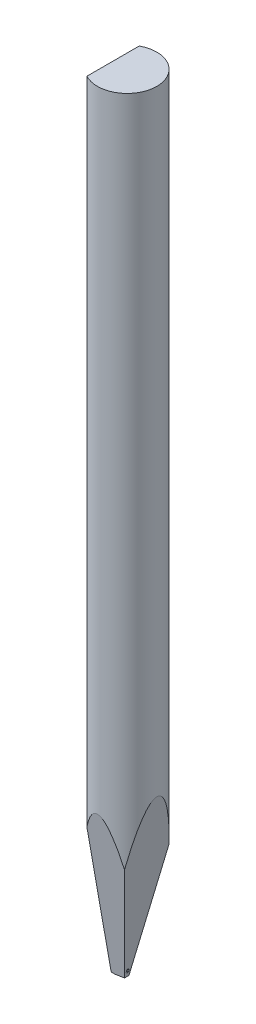
ISO-10303-21;
HEADER;
FILE_DESCRIPTION(('STEP AP214'),'2;1');
FILE_NAME('part.step','',(''),(''),'','','');
FILE_SCHEMA(('AUTOMOTIVE_DESIGN { 1 0 10303 214 1 1 1 1 }'));
ENDSEC;
DATA;
#1=APPLICATION_CONTEXT('core data for automotive mechanical design processes');
#2=APPLICATION_PROTOCOL_DEFINITION('international standard','automotive_design',2000,#1);
#3=PRODUCT_CONTEXT('',#1,'mechanical');
#4=PRODUCT('Part','Part','',(#3));
#5=PRODUCT_RELATED_PRODUCT_CATEGORY('part','',(#4));
#6=PRODUCT_DEFINITION_FORMATION('','',#4);
#7=PRODUCT_DEFINITION_CONTEXT('part definition',#1,'design');
#8=PRODUCT_DEFINITION('design','',#6,#7);
#9=PRODUCT_DEFINITION_SHAPE('','',#8);
#10=(LENGTH_UNIT() NAMED_UNIT(*) SI_UNIT(.MILLI.,.METRE.));
#11=(NAMED_UNIT(*) PLANE_ANGLE_UNIT() SI_UNIT($,.RADIAN.));
#12=(NAMED_UNIT(*) SI_UNIT($,.STERADIAN.) SOLID_ANGLE_UNIT());
#13=UNCERTAINTY_MEASURE_WITH_UNIT(LENGTH_MEASURE(1.E-05),#10,'distance_accuracy_value','');
#14=(GEOMETRIC_REPRESENTATION_CONTEXT(3) GLOBAL_UNCERTAINTY_ASSIGNED_CONTEXT((#13)) GLOBAL_UNIT_ASSIGNED_CONTEXT((#10,
#11,#12)) REPRESENTATION_CONTEXT('',''));
#15=CARTESIAN_POINT('',(0.,0.,0.));
#16=DIRECTION('',(0.,0.,1.));
#17=DIRECTION('',(1.,0.,0.));
#18=AXIS2_PLACEMENT_3D('',#15,#16,#17);
#19=CARTESIAN_POINT('',(26.8738719491216,0.,0.0508));
#20=DIRECTION('',(0.,-0.173648177666931,0.984807753012208));
#21=DIRECTION('',(0.,-0.984807753012208,-0.173648177666931));
#22=AXIS2_PLACEMENT_3D('',#19,#20,#21);
#23=PLANE('',#22);
#24=CARTESIAN_POINT('',(-0.35306,0.02286,0.0548308347789982));
#25=DIRECTION('',(0.,-0.173648177666931,0.984807753012208));
#26=DIRECTION('',(0.,-0.984807753012208,-0.173648177666931));
#27=AXIS2_PLACEMENT_3D('',#24,#25,#26);
#28=ELLIPSE('',#27,0.0232126523477081,0.02286);
#29=CARTESIAN_POINT('',(-0.35306,0.,0.0508000000000026));
#30=VERTEX_POINT('',#29);
#31=CARTESIAN_POINT('',(-0.37592,0.02286,0.0548308347789982));
#32=VERTEX_POINT('',#31);
#33=EDGE_CURVE('E216',#30,#32,#28,.F.);
#34=ORIENTED_EDGE('',*,*,#33,.F.);
#35=DIRECTION('',(-1.,0.,0.));
#36=VECTOR('',#35,1.);
#37=CARTESIAN_POINT('',(26.8738719491216,0.,0.0508));
#38=LINE('',#37,#36);
#39=CARTESIAN_POINT('',(-0.287019999999997,0.,0.0508));
#40=VERTEX_POINT('',#39);
#41=EDGE_CURVE('E287',#40,#30,#38,.T.);
#42=ORIENTED_EDGE('',*,*,#41,.F.);
#43=DIRECTION('',(-0.984346441568213,-0.173566836012845,-0.0306045161452665));
#44=VECTOR('',#43,1.);
#45=CARTESIAN_POINT('',(26.0301980698046,4.64043560289492,0.869033999030531));
#46=LINE('',#45,#44);
#47=CARTESIAN_POINT('',(-0.0117618940403387,0.0485354307393987,0.0593581059596632));
#48=VERTEX_POINT('',#47);
#49=EDGE_CURVE('E284',#48,#40,#46,.T.);
#50=ORIENTED_EDGE('',*,*,#49,.F.);
#51=DIRECTION('',(-0.171087869746036,-0.970287525247814,-0.171087869746036));
#52=VECTOR('',#51,1.);
#53=CARTESIAN_POINT('',(0.766901483986011,4.46455489014234,0.838021483986016));
#54=LINE('',#53,#52);
#55=CARTESIAN_POINT('',(0.523678555180163,3.08516911589156,0.594798555180167));
#56=VERTEX_POINT('',#55);
#57=EDGE_CURVE('E281',#56,#48,#54,.T.);
#58=ORIENTED_EDGE('',*,*,#57,.F.);
#59=CARTESIAN_POINT('',(0.,-0.288101116436578,0.));
#60=DIRECTION('',(0.,-0.173648177666931,0.984807753012208));
#61=DIRECTION('',(0.,-0.984807753012208,-0.173648177666931));
#62=AXIS2_PLACEMENT_3D('',#59,#60,#61);
#63=ELLIPSE('',#62,4.56371043248163,0.792479999999998);
#64=CARTESIAN_POINT('',(-0.37592,3.66844093071415,0.69764511322018));
#65=VERTEX_POINT('',#64);
#66=EDGE_CURVE('E292',#56,#65,#63,.T.);
#67=ORIENTED_EDGE('',*,*,#66,.T.);
#68=DIRECTION('',(0.,0.984807753012208,0.173648177666931));
#69=VECTOR('',#68,1.);
#70=CARTESIAN_POINT('',(-0.37592,20.251112252608,3.62161747949059));
#71=LINE('',#70,#69);
#72=EDGE_CURVE('E306',#32,#65,#71,.T.);
#73=ORIENTED_EDGE('',*,*,#72,.F.);
#74=EDGE_LOOP('',(#34,#42,#50,#58,#67,#73));
#75=FACE_BOUND('',#74,.T.);
#76=ADVANCED_FACE('F46',(#75),#23,.T.);
#77=CARTESIAN_POINT('',(26.8738719491216,0.,-0.0508));
#78=DIRECTION('',(0.,-0.173648177666931,-0.984807753012208));
#79=DIRECTION('',(0.,0.984807753012208,-0.173648177666931));
#80=AXIS2_PLACEMENT_3D('',#77,#78,#79);
#81=PLANE('',#80);
#82=CARTESIAN_POINT('',(-0.35306,0.02286,-0.0548308347789982));
#83=DIRECTION('',(0.,-0.173648177666931,-0.984807753012208));
#84=DIRECTION('',(0.,0.984807753012208,-0.173648177666931));
#85=AXIS2_PLACEMENT_3D('',#82,#83,#84);
#86=ELLIPSE('',#85,0.0232126523477081,0.02286);
#87=CARTESIAN_POINT('',(-0.37592,0.02286,-0.0548308347789982));
#88=VERTEX_POINT('',#87);
#89=CARTESIAN_POINT('',(-0.35306,0.,-0.0508000000000026));
#90=VERTEX_POINT('',#89);
#91=EDGE_CURVE('E213',#88,#90,#86,.F.);
#92=ORIENTED_EDGE('',*,*,#91,.F.);
#93=DIRECTION('',(0.,-0.984807753012208,0.173648177666931));
#94=VECTOR('',#93,1.);
#95=CARTESIAN_POINT('',(-0.37592,20.5255765703836,-3.67001294395617));
#96=LINE('',#95,#94);
#97=CARTESIAN_POINT('',(-0.37592,3.66844093071414,-0.69764511322018));
#98=VERTEX_POINT('',#97);
#99=EDGE_CURVE('E205',#98,#88,#96,.T.);
#100=ORIENTED_EDGE('',*,*,#99,.F.);
#101=CARTESIAN_POINT('',(0.,-0.288101116436578,0.));
#102=DIRECTION('',(0.,-0.173648177666931,-0.984807753012208));
#103=DIRECTION('',(0.,-0.984807753012208,0.173648177666931));
#104=AXIS2_PLACEMENT_3D('',#101,#102,#103);
#105=ELLIPSE('',#104,4.56371043248163,0.792479999999998);
#106=CARTESIAN_POINT('',(0.523678555180163,3.08516911589156,-0.594798555180167));
#107=VERTEX_POINT('',#106);
#108=EDGE_CURVE('E295',#98,#107,#105,.T.);
#109=ORIENTED_EDGE('',*,*,#108,.T.);
#110=DIRECTION('',(0.171087869746036,0.970287525247814,-0.171087869746036));
#111=VECTOR('',#110,1.);
#112=CARTESIAN_POINT('',(0.766901483986011,4.46455489014234,-0.838021483986016));
#113=LINE('',#112,#111);
#114=CARTESIAN_POINT('',(-0.0117618940403387,0.0485354307393987,-0.0593581059596632));
#115=VERTEX_POINT('',#114);
#116=EDGE_CURVE('E309',#115,#107,#113,.T.);
#117=ORIENTED_EDGE('',*,*,#116,.F.);
#118=DIRECTION('',(0.984346441568213,0.173566836012845,-0.0306045161452665));
#119=VECTOR('',#118,1.);
#120=CARTESIAN_POINT('',(26.0301980698046,4.64043560289492,-0.869033999030531));
#121=LINE('',#120,#119);
#122=CARTESIAN_POINT('',(-0.287019999999997,0.,-0.0508));
#123=VERTEX_POINT('',#122);
#124=EDGE_CURVE('E312',#123,#115,#121,.T.);
#125=ORIENTED_EDGE('',*,*,#124,.F.);
#126=DIRECTION('',(-1.,0.,0.));
#127=VECTOR('',#126,1.);
#128=CARTESIAN_POINT('',(26.8738719491216,0.,-0.0508));
#129=LINE('',#128,#127);
#130=EDGE_CURVE('E289',#123,#90,#129,.T.);
#131=ORIENTED_EDGE('',*,*,#130,.T.);
#132=EDGE_LOOP('',(#92,#100,#109,#117,#125,#131));
#133=FACE_BOUND('',#132,.T.);
#134=ADVANCED_FACE('F401',(#133),#81,.T.);
#135=CARTESIAN_POINT('',(-0.28702,0.,27.2760283406468));
#136=DIRECTION('',(-0.173648177666931,0.984807753012208,0.));
#137=DIRECTION('',(-0.984807753012208,-0.173648177666931,0.));
#138=AXIS2_PLACEMENT_3D('',#135,#136,#137);
#139=PLANE('',#138);
#140=DIRECTION('',(-0.984807753012208,-0.173648177666931,0.));
#141=VECTOR('',#140,1.);
#142=CARTESIAN_POINT('',(-0.28702,0.,0.0215899999999984));
#143=LINE('',#142,#141);
#144=CARTESIAN_POINT('',(-0.127,0.0282158434529687,0.0215899999999992));
#145=VERTEX_POINT('',#144);
#146=CARTESIAN_POINT('',(-0.27611358901615,0.00192309451914804,0.02159));
#147=VERTEX_POINT('',#146);
#148=EDGE_CURVE('E267',#145,#147,#143,.T.);
#149=ORIENTED_EDGE('',*,*,#148,.F.);
#150=DIRECTION('',(0.,0.,1.));
#151=VECTOR('',#150,1.);
#152=CARTESIAN_POINT('',(-0.127,0.0282158434529687,27.2760283406468));
#153=LINE('',#152,#151);
#154=CARTESIAN_POINT('',(-0.127,0.0282158434529687,-0.0215899999999992));
#155=VERTEX_POINT('',#154);
#156=EDGE_CURVE('E323',#155,#145,#153,.T.);
#157=ORIENTED_EDGE('',*,*,#156,.F.);
#158=DIRECTION('',(-0.984807753012208,-0.173648177666931,0.));
#159=VECTOR('',#158,1.);
#160=CARTESIAN_POINT('',(-0.28702,0.,-0.0215899999999984));
#161=LINE('',#160,#159);
#162=CARTESIAN_POINT('',(-0.27611358901615,0.00192309451914804,-0.02159));
#163=VERTEX_POINT('',#162);
#164=EDGE_CURVE('E263',#155,#163,#161,.T.);
#165=ORIENTED_EDGE('',*,*,#164,.T.);
#166=CARTESIAN_POINT('',(-0.971260151536871,-0.12065,0.));
#167=DIRECTION('',(-0.173648177666931,0.984807753012208,0.));
#168=DIRECTION('',(-0.984807753012208,-0.173648177666931,0.));
#169=AXIS2_PLACEMENT_3D('',#166,#167,#168);
#170=ELLIPSE('',#169,0.716736574332053,0.12446);
#171=CARTESIAN_POINT('',(-0.28702,0.,-0.0305592719154098));
#172=VERTEX_POINT('',#171);
#173=EDGE_CURVE('E315',#163,#172,#170,.T.);
#174=ORIENTED_EDGE('',*,*,#173,.T.);
#175=DIRECTION('',(0.,0.,-1.));
#176=VECTOR('',#175,1.);
#177=CARTESIAN_POINT('',(-0.28702,0.,27.2760283406468));
#178=LINE('',#177,#176);
#179=EDGE_CURVE('E273',#172,#123,#178,.T.);
#180=ORIENTED_EDGE('',*,*,#179,.T.);
#181=ORIENTED_EDGE('',*,*,#124,.T.);
#182=DIRECTION('',(0.,0.,-1.));
#183=VECTOR('',#182,1.);
#184=CARTESIAN_POINT('',(-0.0117618940403371,0.0485354307393984,27.2760283406468));
#185=LINE('',#184,#183);
#186=EDGE_CURVE('E270',#48,#115,#185,.T.);
#187=ORIENTED_EDGE('',*,*,#186,.F.);
#188=ORIENTED_EDGE('',*,*,#49,.T.);
#189=CARTESIAN_POINT('',(-0.287020000000002,0.,0.0305592719154106));
#190=VERTEX_POINT('',#189);
#191=EDGE_CURVE('E275',#40,#190,#178,.T.);
#192=ORIENTED_EDGE('',*,*,#191,.T.);
#193=EDGE_CURVE('E316',#190,#147,#170,.T.);
#194=ORIENTED_EDGE('',*,*,#193,.T.);
#195=EDGE_LOOP('',(#149,#157,#165,#174,#180,#181,#187,#188,#192,#194));
#196=FACE_BOUND('',#195,.T.);
#197=ADVANCED_FACE('F348',(#196),#139,.F.);
#198=CARTESIAN_POINT('',(26.7627469491216,-0.12065,0.));
#199=DIRECTION('',(-1.,0.,0.));
#200=DIRECTION('',(0.,0.,1.));
#201=AXIS2_PLACEMENT_3D('',#198,#199,#200);
#202=CYLINDRICAL_SURFACE('',#201,0.12446);
#203=DIRECTION('',(-1.,0.,0.));
#204=VECTOR('',#203,1.);
#205=CARTESIAN_POINT('',(26.7627469491216,0.,0.0305592719154106));
#206=LINE('',#205,#204);
#207=CARTESIAN_POINT('',(-0.353059999999999,0.,0.0305592719154102));
#208=VERTEX_POINT('',#207);
#209=EDGE_CURVE('E322',#190,#208,#206,.T.);
#210=ORIENTED_EDGE('',*,*,#209,.T.);
#211=CARTESIAN_POINT('',(-0.35306,0.,0.0305592719154105));
#212=CARTESIAN_POINT('',(-0.353433177495713,-3.4115700480833E-07,0.0305604120455066));
#213=CARTESIAN_POINT('',(-0.35380481473307,9.12342242850821E-06,0.0305232652201642));
#214=CARTESIAN_POINT('',(-0.354530147645717,4.45600474576895E-05,0.0303829399456327));
#215=CARTESIAN_POINT('',(-0.354884006265433,7.03304745953952E-05,0.0302805678869375));
#216=CARTESIAN_POINT('',(-0.355566850741517,0.00013525352697127,0.0300205045838776));
#217=CARTESIAN_POINT('',(-0.355895946578497,0.000174342120017103,0.029863077941626));
#218=CARTESIAN_POINT('',(-0.356528722691961,0.000262443040749248,0.0295043635638638));
#219=CARTESIAN_POINT('',(-0.356832316160832,0.000311487464106235,0.0293029338066951));
#220=CARTESIAN_POINT('',(-0.35763178834136,0.000455814668952359,0.0287023593347366));
#221=CARTESIAN_POINT('',(-0.358100246295292,0.000558098867618606,0.0282685761849347));
#222=CARTESIAN_POINT('',(-0.358965854231094,0.000771572388083865,0.0273372603516326));
#223=CARTESIAN_POINT('',(-0.3593627916304,0.00088278688212757,0.0268395449130287));
#224=CARTESIAN_POINT('',(-0.360434283973501,0.00120938608304231,0.0253297826243709));
#225=CARTESIAN_POINT('',(-0.361030909802205,0.0014270583689581,0.0242634895959853));
#226=CARTESIAN_POINT('',(-0.3620738879093,0.00184491377799584,0.022058395000956));
#227=CARTESIAN_POINT('',(-0.362519839870592,0.00204504928107099,0.0209194096889787));
#228=CARTESIAN_POINT('',(-0.363746617717283,0.00262962458306816,0.0172820300366819));
#229=CARTESIAN_POINT('',(-0.364331796347962,0.00296493482900228,0.0147102260569059));
#230=CARTESIAN_POINT('',(-0.365184550610992,0.00347492912782558,0.00949982929482204));
#231=CARTESIAN_POINT('',(-0.365451107390649,0.00364909750053125,0.00686104966726132));
#232=CARTESIAN_POINT('',(-0.36574279704018,0.00383976034682131,0.00122470237351707));
#233=CARTESIAN_POINT('',(-0.365732691795458,0.00383323950403989,-0.00177558850187591));
#234=CARTESIAN_POINT('',(-0.365383674905822,0.00360491126544181,-0.00773750359229845));
#235=CARTESIAN_POINT('',(-0.365046149857534,0.00338401174443802,-0.0106992375037074));
#236=CARTESIAN_POINT('',(-0.364093178206363,0.0028333681603385,-0.0157018248737312));
#237=CARTESIAN_POINT('',(-0.363583214651265,0.00255201859592672,-0.0177664082167557));
#238=CARTESIAN_POINT('',(-0.362507042078195,0.00203879342347467,-0.020957437104662));
#239=CARTESIAN_POINT('',(-0.362048065533819,0.00183333600841451,-0.0221239201310059));
#240=CARTESIAN_POINT('',(-0.360971530544002,0.00140464298976707,-0.0243770855834131));
#241=CARTESIAN_POINT('',(-0.360354776256994,0.00118150138615126,-0.0254641377562429));
#242=CARTESIAN_POINT('',(-0.359339372379281,0.000877424051785944,-0.0268615508779846));
#243=CARTESIAN_POINT('',(-0.359037413005832,0.000792832100550351,-0.0272409546456175));
#244=CARTESIAN_POINT('',(-0.358391920400731,0.000627987501096351,-0.0279656584366945));
#245=CARTESIAN_POINT('',(-0.358048311130018,0.00054774318860672,-0.0283108939284926));
#246=CARTESIAN_POINT('',(-0.357309539693619,0.000395247281023293,-0.028956025173791));
#247=CARTESIAN_POINT('',(-0.356913719550484,0.000323124188337631,-0.029255213797029));
#248=CARTESIAN_POINT('',(-0.356073993854414,0.000195626538281624,-0.0297774738793415));
#249=CARTESIAN_POINT('',(-0.355630417761091,0.000140146108859585,-0.0300010277049098));
#250=CARTESIAN_POINT('',(-0.354832778100701,6.64124029636152E-05,-0.0302961531870139));
#251=CARTESIAN_POINT('',(-0.354488690980499,4.20751715832177E-05,-0.0303927968636544));
#252=CARTESIAN_POINT('',(-0.353783667176885,8.61483340008675E-06,-0.0305252692481336));
#253=CARTESIAN_POINT('',(-0.353422565772961,-2.98528522923477E-07,-0.0305602596653233));
#254=CARTESIAN_POINT('',(-0.353060000136931,-3.96410119775496E-11,-0.0305592722752992));
#255=B_SPLINE_CURVE_WITH_KNOTS('',3,(#211,#212,#213,#214,#215,#216,#217,#218,#219,#220,#221,
#222,#223,#224,#225,#226,#227,#228,#229,#230,#231,#232,#233,#234,#235,#236,#237,#238,#239,#240,
#241,#242,#243,#244,#245,#246,#247,#248,#249,#250,#251,#252,#253,#254),.UNSPECIFIED.,.F.,.F.,(4,
2,2,2,2,2,2,2,2,2,2,2,2,2,2,2,2,2,2,2,2,4),(0.,0.00111512790921322,0.00221672996284695,
0.00331310867867811,0.00441307970067523,0.00634162491538647,0.00827581109345661,
0.0119781526815259,0.0156902548575423,0.0236223942955505,0.0315798309462445,0.0405550122159596,
0.0494923495034479,0.0559042482343462,0.0597083327673509,0.0634934021345639,0.0649678813134468,
0.0664450941424127,0.0679431143118251,0.0694313922553077,0.0705004947463412,0.0715840246470348),.UNSPECIFIED.);
#256=CARTESIAN_POINT('',(-0.363580535706561,0.00257444728631308,0.0174864972070959));
#257=VERTEX_POINT('',#256);
#258=EDGE_CURVE('E214',#208,#257,#255,.T.);
#259=ORIENTED_EDGE('',*,*,#258,.T.);
#260=CARTESIAN_POINT('',(-0.37592,0.,-0.0305592719154106));
#261=CARTESIAN_POINT('',(-0.365756406466233,0.00252614227819303,-0.0205858973301904));
#262=CARTESIAN_POINT('',(-0.355600000000001,0.00381000000000001,-0.010291546042832));
#263=CARTESIAN_POINT('',(-0.355600000000001,0.00381000000000001,0.010291546042832));
#264=CARTESIAN_POINT('',(-0.365756406466233,0.00252614227819303,0.0205858973301904));
#265=CARTESIAN_POINT('',(-0.37592,0.,0.0305592719154106));
#266=(BOUNDED_CURVE() B_SPLINE_CURVE(3,(#260,#261,#262,#263,#264,#265),.UNSPECIFIED.,.F.,
.F.) B_SPLINE_CURVE_WITH_KNOTS((4,2,4),(1.32272489561682,1.5707963267949,1.81886775797297),
.UNSPECIFIED.) CURVE() GEOMETRIC_REPRESENTATION_ITEM() RATIONAL_B_SPLINE_CURVE((1.,1.,1.,1.,1.,1.)) REPRESENTATION_ITEM(''));
#267=CARTESIAN_POINT('',(-0.363580503871641,0.00257444367399588,-0.0174865227012201));
#268=VERTEX_POINT('',#267);
#269=EDGE_CURVE('E197',#257,#268,#266,.F.);
#270=ORIENTED_EDGE('',*,*,#269,.T.);
#271=CARTESIAN_POINT('',(-0.353059999999999,0.,-0.0305592719154102));
#272=VERTEX_POINT('',#271);
#273=EDGE_CURVE('E79',#268,#272,#255,.T.);
#274=ORIENTED_EDGE('',*,*,#273,.T.);
#275=DIRECTION('',(-1.,0.,0.));
#276=VECTOR('',#275,1.);
#277=CARTESIAN_POINT('',(26.7627469491216,0.,-0.0305592719154106));
#278=LINE('',#277,#276);
#279=EDGE_CURVE('E274',#172,#272,#278,.T.);
#280=ORIENTED_EDGE('',*,*,#279,.F.);
#281=ORIENTED_EDGE('',*,*,#173,.F.);
#282=DIRECTION('',(-1.,0.,0.));
#283=VECTOR('',#282,1.);
#284=CARTESIAN_POINT('',(26.7627469491216,0.00192309451914804,-0.02159));
#285=LINE('',#284,#283);
#286=CARTESIAN_POINT('',(-0.291459716238084,0.00192309451914819,-0.02159));
#287=VERTEX_POINT('',#286);
#288=EDGE_CURVE('E319',#163,#287,#285,.T.);
#289=ORIENTED_EDGE('',*,*,#288,.T.);
#290=CARTESIAN_POINT('',(-0.291459716238094,0.00192309451914803,0.02159));
#291=CARTESIAN_POINT('',(-0.297460178252704,0.00118787390454153,0.025764074381037));
#292=CARTESIAN_POINT('',(-0.306243447027379,0.00118399619739461,0.025784693885801));
#293=CARTESIAN_POINT('',(-0.321343933571846,0.00265973639489125,0.0174092497952559));
#294=CARTESIAN_POINT('',(-0.327055646480616,0.00381585980395339,0.00881095094648123));
#295=CARTESIAN_POINT('',(-0.32700824296768,0.00380408565809902,-0.0089757270638779));
#296=CARTESIAN_POINT('',(-0.321271339247885,0.0026434740968879,-0.0175165527664138));
#297=CARTESIAN_POINT('',(-0.30615317400564,0.00117331647331485,-0.0258300201150016));
#298=CARTESIAN_POINT('',(-0.297433135401437,0.00119056758668176,-0.0257487815160265));
#299=CARTESIAN_POINT('',(-0.291459716238085,0.00192309451914805,-0.02159));
#300=(BOUNDED_CURVE() B_SPLINE_CURVE(3,(#290,#291,#292,#293,#294,#295,#296,#297,#298,#299),
.UNSPECIFIED.,.F.,.F.) B_SPLINE_CURVE_WITH_KNOTS((4,2,2,2,4),(0.,1.78289568717994E-05,
3.5657913743598E-05,5.34868706153965E-05,7.1315827487195E-05),
.UNSPECIFIED.) CURVE() GEOMETRIC_REPRESENTATION_ITEM() RATIONAL_B_SPLINE_CURVE((1.,1.,1.,1.,1.,
1.,1.,1.,1.,1.)) REPRESENTATION_ITEM(''));
#301=CARTESIAN_POINT('',(-0.291459716238084,0.00192309451914775,0.02159));
#302=VERTEX_POINT('',#301);
#303=EDGE_CURVE('E325',#287,#302,#300,.F.);
#304=ORIENTED_EDGE('',*,*,#303,.T.);
#305=DIRECTION('',(-1.,0.,0.));
#306=VECTOR('',#305,1.);
#307=CARTESIAN_POINT('',(26.7627469491216,0.00192309451914804,0.02159));
#308=LINE('',#307,#306);
#309=EDGE_CURVE('E326',#147,#302,#308,.T.);
#310=ORIENTED_EDGE('',*,*,#309,.F.);
#311=ORIENTED_EDGE('',*,*,#193,.F.);
#312=EDGE_LOOP('',(#210,#259,#270,#274,#280,#281,#289,#304,#310,#311));
#313=FACE_BOUND('',#312,.T.);
#314=ADVANCED_FACE('F337',(#313),#202,.F.);
#315=CARTESIAN_POINT('',(0.,0.,0.));
#316=DIRECTION('',(0.,1.,0.));
#317=DIRECTION('',(0.,0.,1.));
#318=AXIS2_PLACEMENT_3D('',#315,#316,#317);
#319=PLANE('',#318);
#320=ORIENTED_EDGE('',*,*,#41,.T.);
#321=DIRECTION('',(0.,0.,-1.));
#322=VECTOR('',#321,1.);
#323=CARTESIAN_POINT('',(-0.35306,0.,26.4375286070088));
#324=LINE('',#323,#322);
#325=EDGE_CURVE('E71',#30,#208,#324,.T.);
#326=ORIENTED_EDGE('',*,*,#325,.T.);
#327=ORIENTED_EDGE('',*,*,#209,.F.);
#328=ORIENTED_EDGE('',*,*,#191,.F.);
#329=EDGE_LOOP('',(#320,#326,#327,#328));
#330=FACE_BOUND('',#329,.T.);
#331=ADVANCED_FACE('F347',(#330),#319,.F.);
#332=ORIENTED_EDGE('',*,*,#279,.T.);
#333=EDGE_CURVE('E212',#272,#90,#324,.T.);
#334=ORIENTED_EDGE('',*,*,#333,.T.);
#335=ORIENTED_EDGE('',*,*,#130,.F.);
#336=ORIENTED_EDGE('',*,*,#179,.F.);
#337=EDGE_LOOP('',(#332,#334,#335,#336));
#338=FACE_BOUND('',#337,.T.);
#339=ADVANCED_FACE('F406',(#338),#319,.F.);
#340=CARTESIAN_POINT('',(0.,21.0312,0.));
#341=DIRECTION('',(0.,-1.,0.));
#342=DIRECTION('',(0.,0.,-1.));
#343=AXIS2_PLACEMENT_3D('',#340,#341,#342);
#344=CYLINDRICAL_SURFACE('',#343,0.792479999999998);
#345=ORIENTED_EDGE('',*,*,#66,.F.);
#346=CARTESIAN_POINT('',(0.,0.115240446574634,0.));
#347=DIRECTION('',(-0.984807753012208,0.173648177666931,0.));
#348=DIRECTION('',(-0.173648177666931,-0.984807753012208,0.));
#349=AXIS2_PLACEMENT_3D('',#346,#347,#348);
#350=ELLIPSE('',#349,4.56371043248165,0.792479999999998);
#351=EDGE_CURVE('E278',#56,#107,#350,.T.);
#352=ORIENTED_EDGE('',*,*,#351,.T.);
#353=ORIENTED_EDGE('',*,*,#108,.F.);
#354=DIRECTION('',(0.,-1.,0.));
#355=VECTOR('',#354,1.);
#356=CARTESIAN_POINT('',(-0.37592,21.0312,-0.69764511322018));
#357=LINE('',#356,#355);
#358=CARTESIAN_POINT('',(-0.37592,21.0312,-0.69764511322018));
#359=VERTEX_POINT('',#358);
#360=EDGE_CURVE('E301',#359,#98,#357,.T.);
#361=ORIENTED_EDGE('',*,*,#360,.F.);
#362=CARTESIAN_POINT('',(0.,21.0312,0.));
#363=DIRECTION('',(0.,1.,0.));
#364=DIRECTION('',(0.,0.,1.));
#365=AXIS2_PLACEMENT_3D('',#362,#363,#364);
#366=CIRCLE('',#365,0.792479999999998);
#367=CARTESIAN_POINT('',(-0.37592,21.0312,0.69764511322018));
#368=VERTEX_POINT('',#367);
#369=EDGE_CURVE('E303',#368,#359,#366,.T.);
#370=ORIENTED_EDGE('',*,*,#369,.F.);
#371=DIRECTION('',(0.,-1.,0.));
#372=VECTOR('',#371,1.);
#373=CARTESIAN_POINT('',(-0.37592,21.0312,0.69764511322018));
#374=LINE('',#373,#372);
#375=EDGE_CURVE('E299',#65,#368,#374,.F.);
#376=ORIENTED_EDGE('',*,*,#375,.F.);
#377=EDGE_LOOP('',(#345,#352,#353,#361,#370,#376));
#378=FACE_BOUND('',#377,.T.);
#379=ADVANCED_FACE('F400',(#378),#344,.T.);
#380=CARTESIAN_POINT('',(-0.37592,21.0312,-0.80247998));
#381=DIRECTION('',(-1.,0.,0.));
#382=DIRECTION('',(0.,0.,1.));
#383=AXIS2_PLACEMENT_3D('',#380,#381,#382);
#384=PLANE('',#383);
#385=DIRECTION('',(0.,0.,-1.));
#386=VECTOR('',#385,1.);
#387=CARTESIAN_POINT('',(-0.37592,0.02286,26.4375286070088));
#388=LINE('',#387,#386);
#389=CARTESIAN_POINT('',(-0.37592,0.0228587179147043,0.00726320425614687));
#390=VERTEX_POINT('',#389);
#391=EDGE_CURVE('E208',#32,#390,#388,.T.);
#392=ORIENTED_EDGE('',*,*,#391,.F.);
#393=ORIENTED_EDGE('',*,*,#72,.T.);
#394=ORIENTED_EDGE('',*,*,#375,.T.);
#395=DIRECTION('',(0.,0.,-1.));
#396=VECTOR('',#395,1.);
#397=CARTESIAN_POINT('',(-0.37592,21.0312,-0.80247998));
#398=LINE('',#397,#396);
#399=EDGE_CURVE('E297',#368,#359,#398,.T.);
#400=ORIENTED_EDGE('',*,*,#399,.T.);
#401=ORIENTED_EDGE('',*,*,#360,.T.);
#402=ORIENTED_EDGE('',*,*,#99,.T.);
#403=CARTESIAN_POINT('',(-0.37592,0.02286,-0.0068781271838278));
#404=VERTEX_POINT('',#403);
#405=EDGE_CURVE('E202',#404,#88,#388,.T.);
#406=ORIENTED_EDGE('',*,*,#405,.F.);
#407=CARTESIAN_POINT('',(-0.37592,0.,0.0305592719154106));
#408=CARTESIAN_POINT('',(-0.37592,0.0122472013785513,0.0231611880183108));
#409=CARTESIAN_POINT('',(-0.37592,0.0241300000000007,0.0119691830559865));
#410=CARTESIAN_POINT('',(-0.37592,0.0241300000000007,-0.0119691830559865));
#411=CARTESIAN_POINT('',(-0.37592,0.0122472013785514,-0.0231611880183109));
#412=CARTESIAN_POINT('',(-0.37592,0.,-0.0305592719154106));
#413=(BOUNDED_CURVE() B_SPLINE_CURVE(3,(#407,#408,#409,#410,#411,#412),.UNSPECIFIED.,.F.,
.F.) B_SPLINE_CURVE_WITH_KNOTS((4,2,4),(1.32272489561682,1.5707963267949,1.81886775797297),
.UNSPECIFIED.) CURVE() GEOMETRIC_REPRESENTATION_ITEM() RATIONAL_B_SPLINE_CURVE((1.,1.,1.,1.,1.,1.)) REPRESENTATION_ITEM(''));
#414=EDGE_CURVE('E190',#404,#390,#413,.F.);
#415=ORIENTED_EDGE('',*,*,#414,.T.);
#416=EDGE_LOOP('',(#392,#393,#394,#400,#401,#402,#406,#415));
#417=FACE_BOUND('',#416,.T.);
#418=ADVANCED_FACE('F203',(#417),#384,.T.);
#419=CARTESIAN_POINT('',(0.,21.0312,0.));
#420=DIRECTION('',(0.,1.,0.));
#421=DIRECTION('',(0.,0.,1.));
#422=AXIS2_PLACEMENT_3D('',#419,#420,#421);
#423=PLANE('',#422);
#424=ORIENTED_EDGE('',*,*,#369,.T.);
#425=ORIENTED_EDGE('',*,*,#399,.F.);
#426=EDGE_LOOP('',(#424,#425));
#427=FACE_BOUND('',#426,.T.);
#428=ADVANCED_FACE('F399',(#427),#423,.T.);
#429=CARTESIAN_POINT('',(-0.0117618940403371,0.0485354307393984,27.2760283406468));
#430=DIRECTION('',(-0.984807753012208,0.173648177666931,0.));
#431=DIRECTION('',(-0.173648177666931,-0.984807753012208,0.));
#432=AXIS2_PLACEMENT_3D('',#429,#430,#431);
#433=PLANE('',#432);
#434=CARTESIAN_POINT('',(0.0138319103529316,0.193685108289794,0.));
#435=DIRECTION('',(-0.984807753012208,0.173648177666931,0.));
#436=DIRECTION('',(0.173648177666931,0.984807753012208,0.));
#437=AXIS2_PLACEMENT_3D('',#434,#435,#436);
#438=ELLIPSE('',#437,0.0515734368592615,0.0370444608655554);
#439=CARTESIAN_POINT('',(0.0227875436795628,0.244475028758281,0.));
#440=VERTEX_POINT('',#439);
#441=EDGE_CURVE('E269',#440,#440,#438,.F.);
#442=ORIENTED_EDGE('',*,*,#441,.F.);
#443=EDGE_LOOP('',(#442));
#444=FACE_BOUND('',#443,.T.);
#445=ORIENTED_EDGE('',*,*,#351,.F.);
#446=ORIENTED_EDGE('',*,*,#57,.T.);
#447=ORIENTED_EDGE('',*,*,#186,.T.);
#448=ORIENTED_EDGE('',*,*,#116,.T.);
#449=EDGE_LOOP('',(#445,#446,#447,#448));
#450=FACE_BOUND('',#449,.T.);
#451=ADVANCED_FACE('F353',(#444,#450),#433,.F.);
#452=CARTESIAN_POINT('',(-0.127,0.0965200000000001,0.02159));
#453=DIRECTION('',(-1.,0.,0.));
#454=DIRECTION('',(0.,0.,1.));
#455=AXIS2_PLACEMENT_3D('',#452,#453,#454);
#456=PLANE('',#455);
#457=ORIENTED_EDGE('',*,*,#156,.T.);
#458=DIRECTION('',(0.,1.,0.));
#459=VECTOR('',#458,1.);
#460=CARTESIAN_POINT('',(-0.127,0.0965200000000001,0.02159));
#461=LINE('',#460,#459);
#462=CARTESIAN_POINT('',(-0.127,0.0878442483514877,0.02159));
#463=VERTEX_POINT('',#462);
#464=EDGE_CURVE('E251',#145,#463,#461,.T.);
#465=ORIENTED_EDGE('',*,*,#464,.T.);
#466=CARTESIAN_POINT('',(-0.127,0.0965200000000001,0.));
#467=DIRECTION('',(1.,0.,0.));
#468=DIRECTION('',(0.,1.,0.));
#469=AXIS2_PLACEMENT_3D('',#466,#467,#468);
#470=ELLIPSE('',#469,0.0263964543073496,0.02286);
#471=CARTESIAN_POINT('',(-0.127,0.0878442483514877,-0.02159));
#472=VERTEX_POINT('',#471);
#473=EDGE_CURVE('E247',#472,#463,#470,.F.);
#474=ORIENTED_EDGE('',*,*,#473,.F.);
#475=DIRECTION('',(0.,1.,0.));
#476=VECTOR('',#475,1.);
#477=CARTESIAN_POINT('',(-0.127,0.0965200000000001,-0.02159));
#478=LINE('',#477,#476);
#479=EDGE_CURVE('E259',#155,#472,#478,.T.);
#480=ORIENTED_EDGE('',*,*,#479,.F.);
#481=EDGE_LOOP('',(#457,#465,#474,#480));
#482=FACE_BOUND('',#481,.T.);
#483=ADVANCED_FACE('F514',(#482),#456,.T.);
#484=CARTESIAN_POINT('',(-0.0141085328173681,0.161697918967104,0.));
#485=DIRECTION('',(0.866025403784441,0.499999999999995,0.));
#486=DIRECTION('',(-0.499999999999995,0.866025403784441,0.));
#487=AXIS2_PLACEMENT_3D('',#484,#485,#486);
#488=CONICAL_SURFACE('',#487,0.02286,0.392699081698725);
#489=CARTESIAN_POINT('',(-0.0141085328173681,0.161697918967104,0.));
#490=DIRECTION('',(0.866025403784441,0.499999999999995,0.));
#491=DIRECTION('',(-0.499999999999995,0.866025403784441,0.));
#492=AXIS2_PLACEMENT_3D('',#489,#490,#491);
#493=CIRCLE('',#492,0.02286);
#494=CARTESIAN_POINT('',(-0.025538532817368,0.181495259697616,0.));
#495=VERTEX_POINT('',#494);
#496=EDGE_CURVE('E234',#495,#495,#493,.T.);
#497=ORIENTED_EDGE('',*,*,#496,.F.);
#498=EDGE_LOOP('',(#497));
#499=FACE_BOUND('',#498,.T.);
#500=ORIENTED_EDGE('',*,*,#441,.T.);
#501=EDGE_LOOP('',(#500));
#502=FACE_BOUND('',#501,.T.);
#503=ADVANCED_FACE('F519',(#499,#502),#488,.F.);
#504=CARTESIAN_POINT('',(-0.236844167394209,0.0965200000000001,0.));
#505=DIRECTION('',(-0.500000000000004,-0.866025403784436,0.));
#506=DIRECTION('',(0.866025403784436,-0.500000000000004,0.));
#507=AXIS2_PLACEMENT_3D('',#504,#505,#506);
#508=CYLINDRICAL_SURFACE('',#507,0.02159);
#509=DIRECTION('',(-0.500000000000004,-0.866025403784436,0.));
#510=VECTOR('',#509,1.);
#511=CARTESIAN_POINT('',(-0.219427511532293,0.12668653285078,0.02159));
#512=LINE('',#511,#510);
#513=CARTESIAN_POINT('',(-0.236844167394209,0.0965200000000001,0.02159));
#514=VERTEX_POINT('',#513);
#515=EDGE_CURVE('E254',#514,#302,#512,.T.);
#516=ORIENTED_EDGE('',*,*,#515,.T.);
#517=CARTESIAN_POINT('',(-0.291459716238085,0.00192309451914805,-0.02159));
#518=CARTESIAN_POINT('',(-0.297383979721852,0.00611433188257335,-0.0215899999999999));
#519=CARTESIAN_POINT('',(-0.301733160649781,0.00854624116102961,-0.0186086372073556));
#520=CARTESIAN_POINT('',(-0.30790293588728,0.0125135112255706,-0.0106629370188484));
#521=CARTESIAN_POINT('',(-0.309420874550645,0.0139689586247198,-0.00538091032294038));
#522=CARTESIAN_POINT('',(-0.309447834512819,0.0139710310638174,0.00528216693533532));
#523=CARTESIAN_POINT('',(-0.307946709428881,0.0125153242401024,0.0105947996912558));
#524=CARTESIAN_POINT('',(-0.301799168983652,0.00854374566164879,0.0185737052336737));
#525=CARTESIAN_POINT('',(-0.297408393167862,0.00612658454884149,0.0215899999999974));
#526=CARTESIAN_POINT('',(-0.291459716238094,0.00192309451914803,0.02159));
#527=(BOUNDED_CURVE() B_SPLINE_CURVE(3,(#517,#518,#519,#520,#521,#522,#523,#524,#525,#526),
.UNSPECIFIED.,.F.,.F.) B_SPLINE_CURVE_WITH_KNOTS((4,2,2,2,4),(0.,1.78289568717994E-05,
3.5657913743598E-05,5.34868706153965E-05,7.1315827487195E-05),
.UNSPECIFIED.) CURVE() GEOMETRIC_REPRESENTATION_ITEM() RATIONAL_B_SPLINE_CURVE((1.,1.,1.,1.,1.,
1.,1.,1.,1.,1.)) REPRESENTATION_ITEM(''));
#528=EDGE_CURVE('E459',#302,#287,#527,.F.);
#529=ORIENTED_EDGE('',*,*,#528,.T.);
#530=DIRECTION('',(0.500000000000004,0.866025403784436,0.));
#531=VECTOR('',#530,1.);
#532=CARTESIAN_POINT('',(-0.236844167394209,0.0965200000000001,-0.02159));
#533=LINE('',#532,#531);
#534=CARTESIAN_POINT('',(-0.236844167394209,0.0965200000000001,-0.02159));
#535=VERTEX_POINT('',#534);
#536=EDGE_CURVE('E264',#287,#535,#533,.T.);
#537=ORIENTED_EDGE('',*,*,#536,.T.);
#538=CARTESIAN_POINT('',(-0.236844167394209,0.0965200000000001,0.));
#539=DIRECTION('',(0.,-1.,0.));
#540=DIRECTION('',(-1.,0.,0.));
#541=AXIS2_PLACEMENT_3D('',#538,#539,#540);
#542=ELLIPSE('',#541,0.0249299846236081,0.02159);
#543=EDGE_CURVE('E261',#535,#514,#542,.F.);
#544=ORIENTED_EDGE('',*,*,#543,.T.);
#545=EDGE_LOOP('',(#516,#529,#537,#544));
#546=FACE_BOUND('',#545,.T.);
#547=ADVANCED_FACE('F350',(#546),#508,.F.);
#548=CARTESIAN_POINT('',(0.,0.,0.02159));
#549=DIRECTION('',(0.,0.,-1.));
#550=DIRECTION('',(-1.,0.,0.));
#551=AXIS2_PLACEMENT_3D('',#548,#549,#550);
#552=PLANE('',#551);
#553=ORIENTED_EDGE('',*,*,#148,.T.);
#554=ORIENTED_EDGE('',*,*,#309,.T.);
#555=ORIENTED_EDGE('',*,*,#515,.F.);
#556=DIRECTION('',(-1.,0.,0.));
#557=VECTOR('',#556,1.);
#558=CARTESIAN_POINT('',(-0.261774152017817,0.0965200000000001,0.02159));
#559=LINE('',#558,#557);
#560=CARTESIAN_POINT('',(-0.142026842649073,0.0965200000000001,0.02159));
#561=VERTEX_POINT('',#560);
#562=EDGE_CURVE('E252',#561,#514,#559,.T.);
#563=ORIENTED_EDGE('',*,*,#562,.F.);
#564=CARTESIAN_POINT('',(-0.127,0.0965200000000001,0.0215899999999984));
#565=VERTEX_POINT('',#564);
#566=EDGE_CURVE('E248',#565,#561,#559,.T.);
#567=ORIENTED_EDGE('',*,*,#566,.F.);
#568=EDGE_CURVE('E246',#463,#565,#461,.T.);
#569=ORIENTED_EDGE('',*,*,#568,.F.);
#570=ORIENTED_EDGE('',*,*,#464,.F.);
#571=EDGE_LOOP('',(#553,#554,#555,#563,#567,#569,#570));
#572=FACE_BOUND('',#571,.T.);
#573=ADVANCED_FACE('F482',(#572),#552,.T.);
#574=CARTESIAN_POINT('',(0.,0.,-0.02159));
#575=DIRECTION('',(0.,0.,-1.));
#576=DIRECTION('',(-1.,0.,0.));
#577=AXIS2_PLACEMENT_3D('',#574,#575,#576);
#578=PLANE('',#577);
#579=ORIENTED_EDGE('',*,*,#479,.T.);
#580=CARTESIAN_POINT('',(-0.127,0.0965200000000001,-0.0215899999999984));
#581=VERTEX_POINT('',#580);
#582=EDGE_CURVE('E257',#472,#581,#478,.T.);
#583=ORIENTED_EDGE('',*,*,#582,.T.);
#584=DIRECTION('',(-1.,0.,0.));
#585=VECTOR('',#584,1.);
#586=CARTESIAN_POINT('',(-0.261774152017817,0.0965200000000001,-0.02159));
#587=LINE('',#586,#585);
#588=CARTESIAN_POINT('',(-0.142026842649073,0.0965200000000001,-0.02159));
#589=VERTEX_POINT('',#588);
#590=EDGE_CURVE('E255',#581,#589,#587,.T.);
#591=ORIENTED_EDGE('',*,*,#590,.T.);
#592=EDGE_CURVE('E258',#589,#535,#587,.T.);
#593=ORIENTED_EDGE('',*,*,#592,.T.);
#594=ORIENTED_EDGE('',*,*,#536,.F.);
#595=ORIENTED_EDGE('',*,*,#288,.F.);
#596=ORIENTED_EDGE('',*,*,#164,.F.);
#597=EDGE_LOOP('',(#579,#583,#591,#593,#594,#595,#596));
#598=FACE_BOUND('',#597,.T.);
#599=ADVANCED_FACE('F469',(#598),#578,.F.);
#600=CARTESIAN_POINT('',(-0.261774152017817,0.0965200000000001,0.02159));
#601=DIRECTION('',(0.,-1.,0.));
#602=DIRECTION('',(0.,0.,-1.));
#603=AXIS2_PLACEMENT_3D('',#600,#601,#602);
#604=PLANE('',#603);
#605=ORIENTED_EDGE('',*,*,#592,.F.);
#606=CARTESIAN_POINT('',(-0.127,0.0965200000000001,0.));
#607=DIRECTION('',(0.,1.,0.));
#608=DIRECTION('',(1.,0.,0.));
#609=AXIS2_PLACEMENT_3D('',#606,#607,#608);
#610=ELLIPSE('',#609,0.0457200000000004,0.02286);
#611=EDGE_CURVE('E242',#561,#589,#610,.F.);
#612=ORIENTED_EDGE('',*,*,#611,.F.);
#613=ORIENTED_EDGE('',*,*,#562,.T.);
#614=ORIENTED_EDGE('',*,*,#543,.F.);
#615=EDGE_LOOP('',(#605,#612,#613,#614));
#616=FACE_BOUND('',#615,.T.);
#617=ADVANCED_FACE('F618',(#616),#604,.T.);
#618=CARTESIAN_POINT('',(-0.127,0.0965200000000001,26.4421710390159));
#619=DIRECTION('',(1.,0.,0.));
#620=DIRECTION('',(0.,0.,-1.));
#621=AXIS2_PLACEMENT_3D('',#618,#619,#620);
#622=PLANE('',#621);
#623=CARTESIAN_POINT('',(-0.127,0.0965200000000001,-0.0228599999999995));
#624=VERTEX_POINT('',#623);
#625=EDGE_CURVE('E243',#624,#472,#470,.F.);
#626=ORIENTED_EDGE('',*,*,#625,.F.);
#627=DIRECTION('',(0.,0.,-1.));
#628=VECTOR('',#627,1.);
#629=CARTESIAN_POINT('',(-0.127,0.0965200000000001,26.4421710390159));
#630=LINE('',#629,#628);
#631=EDGE_CURVE('E230',#581,#624,#630,.T.);
#632=ORIENTED_EDGE('',*,*,#631,.F.);
#633=ORIENTED_EDGE('',*,*,#582,.F.);
#634=EDGE_LOOP('',(#626,#632,#633));
#635=FACE_BOUND('',#634,.T.);
#636=ADVANCED_FACE('F626',(#635),#622,.T.);
#637=CARTESIAN_POINT('',(-0.261774152017817,0.0965200000000001,26.4421710390159));
#638=DIRECTION('',(0.,1.,0.));
#639=DIRECTION('',(0.,0.,1.));
#640=AXIS2_PLACEMENT_3D('',#637,#638,#639);
#641=PLANE('',#640);
#642=ORIENTED_EDGE('',*,*,#631,.T.);
#643=EDGE_CURVE('E237',#589,#624,#610,.F.);
#644=ORIENTED_EDGE('',*,*,#643,.F.);
#645=ORIENTED_EDGE('',*,*,#590,.F.);
#646=EDGE_LOOP('',(#642,#644,#645));
#647=FACE_BOUND('',#646,.T.);
#648=ADVANCED_FACE('F636',(#647),#641,.T.);
#649=CARTESIAN_POINT('',(-0.378170547226586,-0.0484933830537733,0.));
#650=DIRECTION('',(0.866025403784441,0.499999999999995,0.));
#651=DIRECTION('',(-0.499999999999995,0.866025403784441,0.));
#652=AXIS2_PLACEMENT_3D('',#649,#650,#651);
#653=CYLINDRICAL_SURFACE('',#652,0.02286);
#654=ORIENTED_EDGE('',*,*,#625,.T.);
#655=ORIENTED_EDGE('',*,*,#473,.T.);
#656=CARTESIAN_POINT('',(-0.127,0.0965200000000001,0.0228599999999995));
#657=VERTEX_POINT('',#656);
#658=EDGE_CURVE('E241',#463,#657,#470,.F.);
#659=ORIENTED_EDGE('',*,*,#658,.T.);
#660=EDGE_CURVE('E238',#657,#561,#610,.F.);
#661=ORIENTED_EDGE('',*,*,#660,.T.);
#662=ORIENTED_EDGE('',*,*,#611,.T.);
#663=ORIENTED_EDGE('',*,*,#643,.T.);
#664=EDGE_LOOP('',(#654,#655,#659,#661,#662,#663));
#665=FACE_BOUND('',#664,.T.);
#666=ORIENTED_EDGE('',*,*,#496,.T.);
#667=EDGE_LOOP('',(#666));
#668=FACE_BOUND('',#667,.T.);
#669=ADVANCED_FACE('F648',(#665,#668),#653,.F.);
#670=ORIENTED_EDGE('',*,*,#568,.T.);
#671=EDGE_CURVE('E231',#657,#565,#630,.T.);
#672=ORIENTED_EDGE('',*,*,#671,.F.);
#673=ORIENTED_EDGE('',*,*,#658,.F.);
#674=EDGE_LOOP('',(#670,#672,#673));
#675=FACE_BOUND('',#674,.T.);
#676=ADVANCED_FACE('F639',(#675),#622,.T.);
#677=ORIENTED_EDGE('',*,*,#566,.T.);
#678=ORIENTED_EDGE('',*,*,#660,.F.);
#679=ORIENTED_EDGE('',*,*,#671,.T.);
#680=EDGE_LOOP('',(#677,#678,#679));
#681=FACE_BOUND('',#680,.T.);
#682=ADVANCED_FACE('F419',(#681),#641,.T.);
#683=CARTESIAN_POINT('',(-0.291459716238085,0.00192309451914805,-0.02159));
#684=CARTESIAN_POINT('',(-0.297433135401437,0.00119056758668176,-0.0257487815160265));
#685=CARTESIAN_POINT('',(-0.30615317400564,0.00117331647331485,-0.0258300201150016));
#686=CARTESIAN_POINT('',(-0.321271339247885,0.0026434740968879,-0.0175165527664138));
#687=CARTESIAN_POINT('',(-0.32700824296768,0.00380408565809902,-0.0089757270638779));
#688=CARTESIAN_POINT('',(-0.327055646480616,0.00381585980395339,0.00881095094648123));
#689=CARTESIAN_POINT('',(-0.321343933571846,0.00265973639489125,0.0174092497952559));
#690=CARTESIAN_POINT('',(-0.306243447027379,0.00118399619739461,0.025784693885801));
#691=CARTESIAN_POINT('',(-0.297460178252704,0.00118787390454153,0.025764074381037));
#692=CARTESIAN_POINT('',(-0.291459716238094,0.00192309451914803,0.02159));
#693=CARTESIAN_POINT('',(-0.291459716238085,0.00192309451914805,-0.02159));
#694=CARTESIAN_POINT('',(-0.296796002112849,0.00192449795599981,-0.0215901736060601));
#695=CARTESIAN_POINT('',(-0.30299154166563,0.00239642364959236,-0.020038050843387));
#696=CARTESIAN_POINT('',(-0.312315850395176,0.00339394361065903,-0.0121717058920144));
#697=CARTESIAN_POINT('',(-0.31528339282978,0.0038078591560077,-0.00609131901209346));
#698=CARTESIAN_POINT('',(-0.315317044778215,0.00381212141269104,0.00597961615223374));
#699=CARTESIAN_POINT('',(-0.312370383878009,0.00340068813924407,0.0120950595085349));
#700=CARTESIAN_POINT('',(-0.303067503821679,0.00240198827962979,0.0200043958996332));
#701=CARTESIAN_POINT('',(-0.296823549557194,0.00192438079889811,0.0215908891357723));
#702=CARTESIAN_POINT('',(-0.291459716238094,0.00192309451914803,0.02159));
#703=CARTESIAN_POINT('',(-0.291459716238085,0.00192309451914805,-0.02159));
#704=CARTESIAN_POINT('',(-0.297383979721852,0.00611433188257335,-0.0215899999999999));
#705=CARTESIAN_POINT('',(-0.301733160649781,0.00854624116102961,-0.0186086372073556));
#706=CARTESIAN_POINT('',(-0.30790293588728,0.0125135112255706,-0.0106629370188484));
#707=CARTESIAN_POINT('',(-0.309420874550645,0.0139689586247198,-0.00538091032294038));
#708=CARTESIAN_POINT('',(-0.309447834512819,0.0139710310638174,0.00528216693533532));
#709=CARTESIAN_POINT('',(-0.307946709428881,0.0125153242401024,0.0105947996912558));
#710=CARTESIAN_POINT('',(-0.301799168983652,0.00854374566164879,0.0185737052336737));
#711=CARTESIAN_POINT('',(-0.297408393167862,0.00612658454884149,0.0215899999999974));
#712=CARTESIAN_POINT('',(-0.291459716238094,0.00192309451914803,0.02159));
#713=(BOUNDED_SURFACE() B_SPLINE_SURFACE(2,3,((#683,#684,#685,#686,#687,#688,#689,#690,#691,
#692),(#693,#694,#695,#696,#697,#698,#699,#700,#701,#702),(#703,#704,#705,#706,#707,#708,#709,
#710,#711,#712)),.UNSPECIFIED.,.F.,.F.,.F.) B_SPLINE_SURFACE_WITH_KNOTS((3,3),(4,2,2,2,4),(0.,
1.),(0.,1.78289568717994E-05,3.5657913743598E-05,5.34868706153965E-05,7.1315827487195E-05),
.UNSPECIFIED.) GEOMETRIC_REPRESENTATION_ITEM() RATIONAL_B_SPLINE_SURFACE(((1.,1.,1.,1.,1.,1.,1.,
1.,1.,1.),(0.765986092483117,0.830140123377273,0.851193854294569,0.869277247392156,
0.866031460819852,0.866019402678443,0.869278520414834,0.851361266148128,0.830381312113332,
0.765986092483173),(1.,1.,1.,1.,1.,1.,1.,1.,1.,1.))) REPRESENTATION_ITEM('') SURFACE());
#714=ORIENTED_EDGE('',*,*,#303,.F.);
#715=ORIENTED_EDGE('',*,*,#528,.F.);
#716=EDGE_LOOP('',(#714,#715));
#717=FACE_BOUND('',#716,.T.);
#718=ADVANCED_FACE('F413',(#717),#713,.T.);
#719=CARTESIAN_POINT('',(-0.37592,0.,0.0305592719154106));
#720=CARTESIAN_POINT('',(-0.365756406466233,0.00252614227819303,0.0205858973301904));
#721=CARTESIAN_POINT('',(-0.355600000000001,0.00381000000000001,0.010291546042832));
#722=CARTESIAN_POINT('',(-0.355600000000001,0.00381000000000001,-0.010291546042832));
#723=CARTESIAN_POINT('',(-0.365756406466233,0.00252614227819303,-0.0205858973301904));
#724=CARTESIAN_POINT('',(-0.37592,0.,-0.0305592719154106));
#725=CARTESIAN_POINT('',(-0.37592,0.,0.0305592719154106));
#726=CARTESIAN_POINT('',(-0.375920000000028,0.00252701262539178,0.0205824557074885));
#727=CARTESIAN_POINT('',(-0.375920000000001,0.00381000000000114,0.010291546042832));
#728=CARTESIAN_POINT('',(-0.375920000000001,0.00381000000000114,-0.010291546042832));
#729=CARTESIAN_POINT('',(-0.375920000000028,0.0025270126253917,-0.0205824557074884));
#730=CARTESIAN_POINT('',(-0.37592,0.,-0.0305592719154106));
#731=CARTESIAN_POINT('',(-0.37592,0.,0.0305592719154106));
#732=CARTESIAN_POINT('',(-0.37592,0.0122472013785513,0.0231611880183108));
#733=CARTESIAN_POINT('',(-0.37592,0.0241300000000007,0.0119691830559865));
#734=CARTESIAN_POINT('',(-0.37592,0.0241300000000007,-0.0119691830559865));
#735=CARTESIAN_POINT('',(-0.37592,0.0122472013785514,-0.0231611880183109));
#736=CARTESIAN_POINT('',(-0.37592,0.,-0.0305592719154106));
#737=(BOUNDED_SURFACE() B_SPLINE_SURFACE(2,3,((#719,#720,#721,#722,#723,#724),(#725,#726,#727,
#728,#729,#730),(#731,#732,#733,#734,#735,#736)),.UNSPECIFIED.,.F.,.F.,
.F.) B_SPLINE_SURFACE_WITH_KNOTS((3,3),(4,2,4),(0.,1.),(1.32272489561682,1.5707963267949,
1.81886775797297),.UNSPECIFIED.) GEOMETRIC_REPRESENTATION_ITEM() RATIONAL_B_SPLINE_SURFACE(((1.,
1.,1.,1.,1.,1.),(0.707106781186548,0.707106781186548,0.707106781186556,0.707106781186556,
0.707106781186548,0.707106781186548),(1.,1.,1.,1.,1.,1.))) REPRESENTATION_ITEM('') SURFACE());
#738=CARTESIAN_POINT('',(-0.363592757608991,0.00257107156250729,-0.0175079156899618));
#739=CARTESIAN_POINT('',(-0.363781382637107,0.00266700176199599,-0.0168041859780137));
#740=CARTESIAN_POINT('',(-0.364077098538886,0.00282459338532987,-0.0161646680202825));
#741=CARTESIAN_POINT('',(-0.36493602179249,0.00331992576531089,-0.0147910025685179));
#742=CARTESIAN_POINT('',(-0.365557458545426,0.00370241544010288,-0.0141074558188028));
#743=CARTESIAN_POINT('',(-0.367280735944216,0.00491315352729751,-0.0125388640043048));
#744=CARTESIAN_POINT('',(-0.368427001671404,0.00586864329982001,-0.0118225712211394));
#745=CARTESIAN_POINT('',(-0.371093050979799,0.00861963301296783,-0.0102983510565527));
#746=CARTESIAN_POINT('',(-0.372501272211848,0.0105943352428497,-0.00963313512968514));
#747=CARTESIAN_POINT('',(-0.374655123823463,0.0149679189002834,-0.00846138459774749));
#748=CARTESIAN_POINT('',(-0.375388389326753,0.0173737868265777,-0.00795791717210203));
#749=CARTESIAN_POINT('',(-0.375770806163907,0.020220860057391,-0.00739857938471502));
#750=CARTESIAN_POINT('',(-0.375813566766674,0.0206197024776863,-0.00732103476400241));
#751=CARTESIAN_POINT('',(-0.37589508975257,0.0216312139660147,-0.00712562887574257));
#752=CARTESIAN_POINT('',(-0.375919694543993,0.0222450615323023,-0.00700820507665172));
#753=CARTESIAN_POINT('',(-0.37592,0.0228599999999996,-0.00689060871436534));
#754=B_SPLINE_CURVE_WITH_KNOTS('',3,(#738,#739,#740,#741,#742,#743,#744,#745,#746,#747,#748,
#749,#750,#751,#752,#753),.UNSPECIFIED.,.F.,.F.,(4,2,2,2,2,2,2,4),(0.,0.00215288500068576,
0.00509123020711225,0.00998551375921227,0.0173997815325097,0.0249473187787283,
0.0261727812820828,0.028048411442072),.UNSPECIFIED.);
#755=EDGE_CURVE('E12',#268,#404,#754,.T.);
#756=CARTESIAN_POINT('',(-0.363592757609499,0.00257107156256552,0.017507915690691));
#757=CARTESIAN_POINT('',(-0.363781382646146,0.00266700174903378,0.016804185978031));
#758=CARTESIAN_POINT('',(-0.36407709854625,0.00282459337498046,0.0161646680196502));
#759=CARTESIAN_POINT('',(-0.364936021787577,0.00331992577455797,0.0147910025665539));
#760=CARTESIAN_POINT('',(-0.365557458526869,0.00370241547122235,0.0141074558161935));
#761=CARTESIAN_POINT('',(-0.367280735918765,0.00491315357847796,0.0125388639989476));
#762=CARTESIAN_POINT('',(-0.36842700167156,0.00586864332359259,0.0118225712145521));
#763=CARTESIAN_POINT('',(-0.371093051008413,0.00861963300676918,0.0102983510499517));
#764=CARTESIAN_POINT('',(-0.372501272227079,0.0105943352545502,0.00963313512407032));
#765=CARTESIAN_POINT('',(-0.37465512382697,0.0149679189269808,0.00846138459308358));
#766=CARTESIAN_POINT('',(-0.375388389332104,0.0173737868500371,0.00795791716740676));
#767=CARTESIAN_POINT('',(-0.375770806165494,0.0202208600719297,0.0073985793818728));
#768=CARTESIAN_POINT('',(-0.375813566767018,0.0206197024825258,0.00732103476305923));
#769=CARTESIAN_POINT('',(-0.375895089752372,0.0216312139628227,0.00712562887636729));
#770=CARTESIAN_POINT('',(-0.375919694543828,0.0222450615308553,0.00700820507696791));
#771=CARTESIAN_POINT('',(-0.37592,0.02286,0.00689060871436433));
#772=B_SPLINE_CURVE_WITH_KNOTS('',3,(#756,#757,#758,#759,#760,#761,#762,#763,#764,#765,#766,
#767,#768,#769,#770,#771),.UNSPECIFIED.,.F.,.F.,(4,2,2,2,2,2,2,4),(0.,0.00215288500263541,
0.00509123021150399,0.00998551377412704,0.0173997815496075,0.0249473187989675,
0.0261727812723757,0.0280484114373523),.UNSPECIFIED.);
#773=EDGE_CURVE('E64',#390,#257,#772,.F.);
#774=CARTESIAN_POINT('',(-0.37592,0.,0.0305592719154106));
#775=CARTESIAN_POINT('',(-0.365756406466233,0.00252614227819303,0.0205858973301904));
#776=CARTESIAN_POINT('',(-0.355600000000001,0.00381000000000001,0.010291546042832));
#777=CARTESIAN_POINT('',(-0.355600000000001,0.00381000000000001,-0.010291546042832));
#778=CARTESIAN_POINT('',(-0.365756406466233,0.00252614227819303,-0.0205858973301904));
#779=CARTESIAN_POINT('',(-0.37592,0.,-0.0305592719154106));
#780=CARTESIAN_POINT('',(-0.37592,0.,0.0305592719154106));
#781=CARTESIAN_POINT('',(-0.375920000000028,0.00252701262539178,0.0205824557074885));
#782=CARTESIAN_POINT('',(-0.375920000000001,0.00381000000000114,0.010291546042832));
#783=CARTESIAN_POINT('',(-0.375920000000001,0.00381000000000114,-0.010291546042832));
#784=CARTESIAN_POINT('',(-0.375920000000028,0.0025270126253917,-0.0205824557074884));
#785=CARTESIAN_POINT('',(-0.37592,0.,-0.0305592719154106));
#786=CARTESIAN_POINT('',(-0.37592,0.,0.0305592719154106));
#787=CARTESIAN_POINT('',(-0.37592,0.0122472013785513,0.0231611880183108));
#788=CARTESIAN_POINT('',(-0.37592,0.0241300000000007,0.0119691830559865));
#789=CARTESIAN_POINT('',(-0.37592,0.0241300000000007,-0.0119691830559865));
#790=CARTESIAN_POINT('',(-0.37592,0.0122472013785514,-0.0231611880183109));
#791=CARTESIAN_POINT('',(-0.37592,0.,-0.0305592719154106));
#792=CARTESIAN_POINT('',(-0.37592,0.,0.0305592719154106));
#793=CARTESIAN_POINT('',(-0.37592,0.0122905026102565,0.023172675684665));
#794=CARTESIAN_POINT('',(-0.37592,0.0242205209817011,0.0119766565475893));
#795=CARTESIAN_POINT('',(-0.37592,0.0242205209817011,-0.0119766565475893));
#796=CARTESIAN_POINT('',(-0.37592,0.0122905026102566,-0.0231726756846652));
#797=CARTESIAN_POINT('',(-0.37592,0.,-0.0305592719154106));
#798=CARTESIAN_POINT('',(-0.37592,0.,0.0305592719154106));
#799=CARTESIAN_POINT('',(-0.37592,0.0123338038419616,0.0231841633510193));
#800=CARTESIAN_POINT('',(-0.37592,0.0243110419634014,0.011984130039192));
#801=CARTESIAN_POINT('',(-0.37592,0.0243110419634014,-0.011984130039192));
#802=CARTESIAN_POINT('',(-0.37592,0.0123338038419617,-0.0231841633510194));
#803=CARTESIAN_POINT('',(-0.37592,0.,-0.0305592719154106));
#804=(BOUNDED_SURFACE() B_SPLINE_SURFACE(2,3,((#774,#775,#776,#777,#778,#779),(#780,#781,#782,
#783,#784,#785),(#786,#787,#788,#789,#790,#791),(#792,#793,#794,#795,#796,#797),(#798,#799,#800,
#801,#802,#803)),.UNSPECIFIED.,.F.,.F.,.F.) B_SPLINE_SURFACE_WITH_KNOTS((3,2,3),(4,2,4),
(-0.414213562373095,1.,1.0063),(1.32272489561682,1.5707963267949,1.81886775797297),
.UNSPECIFIED.) GEOMETRIC_REPRESENTATION_ITEM() RATIONAL_B_SPLINE_SURFACE(((2.,2.,2.,2.,2.,2.),
(1.,1.,1.00000000000001,1.00000000000001,1.,1.),(1.,1.,1.,1.,1.,1.),(1.,1.,1.,1.,1.,1.),(1.,1.,
1.,1.,1.,1.))) REPRESENTATION_ITEM('') SURFACE());
#805=ORIENTED_EDGE('',*,*,#755,.F.);
#806=ORIENTED_EDGE('',*,*,#269,.F.);
#807=ORIENTED_EDGE('',*,*,#773,.F.);
#808=ORIENTED_EDGE('',*,*,#414,.F.);
#809=EDGE_LOOP('',(#805,#806,#807,#808));
#810=FACE_BOUND('',#809,.T.);
#811=ADVANCED_FACE('F49',(#810),#804,.T.);
#812=CARTESIAN_POINT('',(-0.35306,0.02286,26.4375286070088));
#813=DIRECTION('',(0.,0.,-1.));
#814=DIRECTION('',(-1.,0.,0.));
#815=AXIS2_PLACEMENT_3D('',#812,#813,#814);
#816=CYLINDRICAL_SURFACE('',#815,0.02286);
#817=ORIENTED_EDGE('',*,*,#325,.F.);
#818=ORIENTED_EDGE('',*,*,#33,.T.);
#819=ORIENTED_EDGE('',*,*,#391,.T.);
#820=ORIENTED_EDGE('',*,*,#773,.T.);
#821=ORIENTED_EDGE('',*,*,#258,.F.);
#822=EDGE_LOOP('',(#817,#818,#819,#820,#821));
#823=FACE_BOUND('',#822,.T.);
#824=ADVANCED_FACE('F494',(#823),#816,.T.);
#825=ORIENTED_EDGE('',*,*,#405,.T.);
#826=ORIENTED_EDGE('',*,*,#91,.T.);
#827=ORIENTED_EDGE('',*,*,#333,.F.);
#828=ORIENTED_EDGE('',*,*,#273,.F.);
#829=ORIENTED_EDGE('',*,*,#755,.T.);
#830=EDGE_LOOP('',(#825,#826,#827,#828,#829));
#831=FACE_BOUND('',#830,.T.);
#832=ADVANCED_FACE('F210',(#831),#816,.T.);
#833=CLOSED_SHELL('',(#76,#134,#197,#314,#331,#339,#379,#418,#428,#451,#483,#503,#547,#573,#599,
#617,#636,#648,#669,#676,#682,#718,#811,#824,#832));
#834=MANIFOLD_SOLID_BREP('B2',#833);
#835=ADVANCED_BREP_SHAPE_REPRESENTATION('',(#18,#834),#14);
#836=SHAPE_DEFINITION_REPRESENTATION(#9,#835);
ENDSEC;
END-ISO-10303-21;
